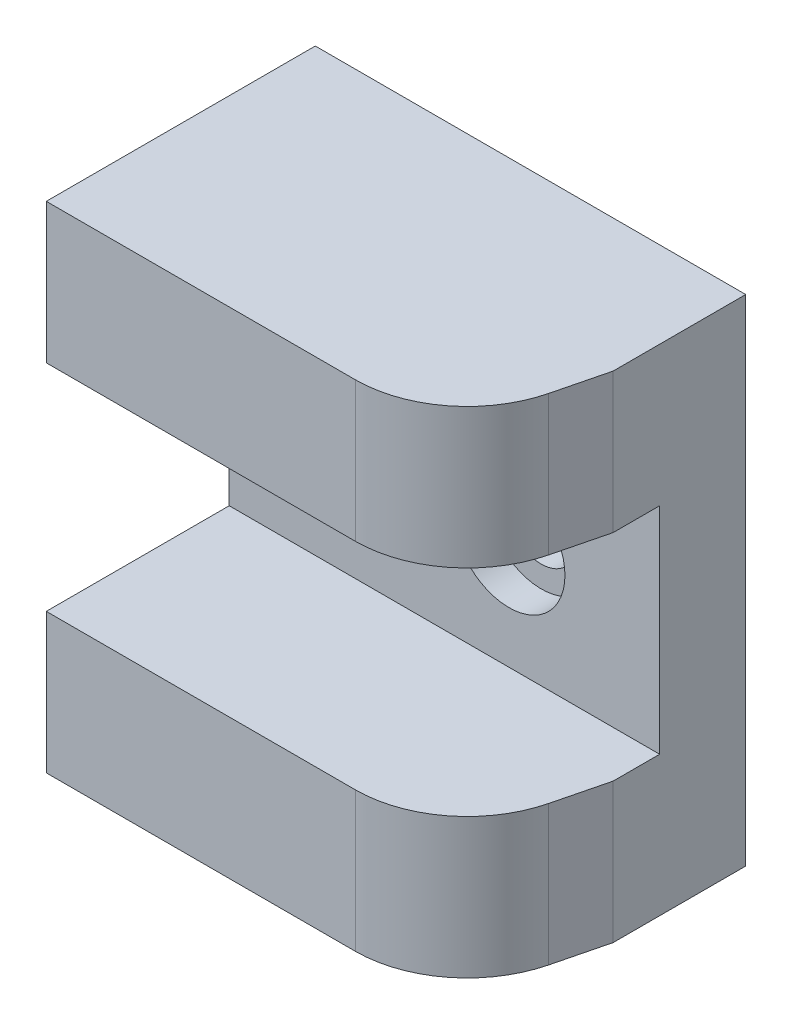
ISO-10303-21;
HEADER;
FILE_DESCRIPTION(('STEP AP214'),'2;1');
FILE_NAME('part.step','',(''),(''),'','','');
FILE_SCHEMA(('AUTOMOTIVE_DESIGN { 1 0 10303 214 1 1 1 1 }'));
ENDSEC;
DATA;
#1=APPLICATION_CONTEXT('core data for automotive mechanical design processes');
#2=APPLICATION_PROTOCOL_DEFINITION('international standard','automotive_design',2000,#1);
#3=PRODUCT_CONTEXT('',#1,'mechanical');
#4=PRODUCT('Part','Part','',(#3));
#5=PRODUCT_RELATED_PRODUCT_CATEGORY('part','',(#4));
#6=PRODUCT_DEFINITION_FORMATION('','',#4);
#7=PRODUCT_DEFINITION_CONTEXT('part definition',#1,'design');
#8=PRODUCT_DEFINITION('design','',#6,#7);
#9=PRODUCT_DEFINITION_SHAPE('','',#8);
#10=(LENGTH_UNIT() NAMED_UNIT(*) SI_UNIT(.MILLI.,.METRE.));
#11=(NAMED_UNIT(*) PLANE_ANGLE_UNIT() SI_UNIT($,.RADIAN.));
#12=(NAMED_UNIT(*) SI_UNIT($,.STERADIAN.) SOLID_ANGLE_UNIT());
#13=UNCERTAINTY_MEASURE_WITH_UNIT(LENGTH_MEASURE(1.E-05),#10,'distance_accuracy_value','');
#14=(GEOMETRIC_REPRESENTATION_CONTEXT(3) GLOBAL_UNCERTAINTY_ASSIGNED_CONTEXT((#13)) GLOBAL_UNIT_ASSIGNED_CONTEXT((#10,
#11,#12)) REPRESENTATION_CONTEXT('',''));
#15=CARTESIAN_POINT('',(0.,0.,0.));
#16=DIRECTION('',(0.,0.,1.));
#17=DIRECTION('',(1.,0.,0.));
#18=AXIS2_PLACEMENT_3D('',#15,#16,#17);
#19=CARTESIAN_POINT('',(0.,0.,12.5));
#20=DIRECTION('',(0.,0.,1.));
#21=DIRECTION('',(1.,0.,0.));
#22=AXIS2_PLACEMENT_3D('',#19,#20,#21);
#23=PLANE('',#22);
#24=DIRECTION('',(1.,0.,0.));
#25=VECTOR('',#24,1.);
#26=CARTESIAN_POINT('',(110.,88.4999999999999,12.5));
#27=LINE('',#26,#25);
#28=CARTESIAN_POINT('',(110.,88.4999999999999,12.5));
#29=VERTEX_POINT('',#28);
#30=CARTESIAN_POINT('',(124.357002553089,88.4999999999999,12.5));
#31=VERTEX_POINT('',#30);
#32=EDGE_CURVE('E142',#29,#31,#27,.T.);
#33=ORIENTED_EDGE('',*,*,#32,.F.);
#34=DIRECTION('',(0.,-1.,0.));
#35=VECTOR('',#34,1.);
#36=CARTESIAN_POINT('',(110.,81.9999999999999,12.5));
#37=LINE('',#36,#35);
#38=CARTESIAN_POINT('',(110.,81.9999999999999,12.5));
#39=VERTEX_POINT('',#38);
#40=EDGE_CURVE('E175',#29,#39,#37,.T.);
#41=ORIENTED_EDGE('',*,*,#40,.T.);
#42=DIRECTION('',(1.,0.,0.));
#43=VECTOR('',#42,1.);
#44=CARTESIAN_POINT('',(130.,81.9999999999999,12.5));
#45=LINE('',#44,#43);
#46=CARTESIAN_POINT('',(124.357002553089,81.9999999999999,12.5000000000004));
#47=VERTEX_POINT('',#46);
#48=EDGE_CURVE('E180',#39,#47,#45,.T.);
#49=ORIENTED_EDGE('',*,*,#48,.T.);
#50=DIRECTION('',(0.,1.,0.));
#51=VECTOR('',#50,1.);
#52=CARTESIAN_POINT('',(124.357002553089,78.4999999999999,12.5000000000002));
#53=LINE('',#52,#51);
#54=EDGE_CURVE('E201',#31,#47,#53,.F.);
#55=ORIENTED_EDGE('',*,*,#54,.F.);
#56=EDGE_LOOP('',(#33,#41,#49,#55));
#57=FACE_BOUND('',#56,.T.);
#58=ADVANCED_FACE('F35',(#57),#23,.T.);
#59=CARTESIAN_POINT('',(129.402540329724,78.4999999999999,8.55799385711866));
#60=DIRECTION('',(-0.970295726275997,0.,-0.241921895599666));
#61=DIRECTION('',(-0.241921895599666,0.,0.970295726275997));
#62=AXIS2_PLACEMENT_3D('',#59,#60,#61);
#63=PLANE('',#62);
#64=DIRECTION('',(0.,1.,0.));
#65=VECTOR('',#64,1.);
#66=CARTESIAN_POINT('',(130.000000000001,78.4999999999999,6.16171400301806));
#67=LINE('',#66,#65);
#68=CARTESIAN_POINT('',(130.000000000001,81.9999999999999,6.16171400301806));
#69=VERTEX_POINT('',#68);
#70=CARTESIAN_POINT('',(130.,88.4999999999999,6.16171400302029));
#71=VERTEX_POINT('',#70);
#72=EDGE_CURVE('E167',#69,#71,#67,.T.);
#73=ORIENTED_EDGE('',*,*,#72,.T.);
#74=DIRECTION('',(-0.241921895599666,0.,0.970295726275997));
#75=VECTOR('',#74,1.);
#76=CARTESIAN_POINT('',(129.402540329724,88.4999999999999,8.55799385711865));
#77=LINE('',#76,#75);
#78=CARTESIAN_POINT('',(129.402540329724,88.4999999999999,8.55799385711866));
#79=VERTEX_POINT('',#78);
#80=EDGE_CURVE('E154',#71,#79,#77,.T.);
#81=ORIENTED_EDGE('',*,*,#80,.T.);
#82=DIRECTION('',(0.,1.,0.));
#83=VECTOR('',#82,1.);
#84=CARTESIAN_POINT('',(129.402540329724,78.4999999999999,8.55799385711866));
#85=LINE('',#84,#83);
#86=CARTESIAN_POINT('',(129.402540329724,81.9999999999999,8.55799385711866));
#87=VERTEX_POINT('',#86);
#88=EDGE_CURVE('E162',#87,#79,#85,.T.);
#89=ORIENTED_EDGE('',*,*,#88,.F.);
#90=DIRECTION('',(-0.241921895599666,0.,0.970295726275997));
#91=VECTOR('',#90,1.);
#92=CARTESIAN_POINT('',(128.512177483807,81.9999999999999,12.1290441834525));
#93=LINE('',#92,#91);
#94=EDGE_CURVE('E204',#69,#87,#93,.T.);
#95=ORIENTED_EDGE('',*,*,#94,.F.);
#96=EDGE_LOOP('',(#73,#81,#89,#95));
#97=FACE_BOUND('',#96,.T.);
#98=ADVANCED_FACE('F248',(#97),#63,.F.);
#99=CARTESIAN_POINT('',(124.357002553089,78.4999999999999,7.3000000000004));
#100=DIRECTION('',(0.,1.,0.));
#101=DIRECTION('',(-1.,0.,0.));
#102=AXIS2_PLACEMENT_3D('',#99,#100,#101);
#103=CYLINDRICAL_SURFACE('',#102,5.20000000000001);
#104=ORIENTED_EDGE('',*,*,#88,.T.);
#105=CARTESIAN_POINT('',(124.357002553089,88.4999999999999,7.3000000000004));
#106=DIRECTION('',(0.,-1.,0.));
#107=DIRECTION('',(0.,0.,-1.));
#108=AXIS2_PLACEMENT_3D('',#105,#106,#107);
#109=CIRCLE('',#108,5.20000000000001);
#110=EDGE_CURVE('E11',#79,#31,#109,.T.);
#111=ORIENTED_EDGE('',*,*,#110,.T.);
#112=ORIENTED_EDGE('',*,*,#54,.T.);
#113=CARTESIAN_POINT('',(124.357002553089,81.9999999999999,7.3000000000004));
#114=DIRECTION('',(0.,1.,0.));
#115=DIRECTION('',(0.,0.,1.));
#116=AXIS2_PLACEMENT_3D('',#113,#114,#115);
#117=CIRCLE('',#116,5.20000000000001);
#118=EDGE_CURVE('E165',#87,#47,#117,.F.);
#119=ORIENTED_EDGE('',*,*,#118,.F.);
#120=EDGE_LOOP('',(#104,#111,#112,#119));
#121=FACE_BOUND('',#120,.T.);
#122=ADVANCED_FACE('F246',(#121),#103,.T.);
#123=CARTESIAN_POINT('',(130.,81.9999999999999,12.5));
#124=DIRECTION('',(-1.,0.,0.));
#125=DIRECTION('',(0.,0.,1.));
#126=AXIS2_PLACEMENT_3D('',#123,#124,#125);
#127=PLANE('',#126);
#128=DIRECTION('',(0.,1.,0.));
#129=VECTOR('',#128,1.);
#130=CARTESIAN_POINT('',(130.,98.4999999999999,4.));
#131=LINE('',#130,#129);
#132=CARTESIAN_POINT('',(130.,88.4999999999999,4.));
#133=VERTEX_POINT('',#132);
#134=CARTESIAN_POINT('',(130.,98.4999999999999,4.));
#135=VERTEX_POINT('',#134);
#136=EDGE_CURVE('E133',#133,#135,#131,.T.);
#137=ORIENTED_EDGE('',*,*,#136,.F.);
#138=DIRECTION('',(0.,0.,1.));
#139=VECTOR('',#138,1.);
#140=CARTESIAN_POINT('',(130.,88.4999999999999,4.));
#141=LINE('',#140,#139);
#142=EDGE_CURVE('E155',#133,#71,#141,.T.);
#143=ORIENTED_EDGE('',*,*,#142,.T.);
#144=ORIENTED_EDGE('',*,*,#72,.F.);
#145=DIRECTION('',(0.,0.,-1.));
#146=VECTOR('',#145,1.);
#147=CARTESIAN_POINT('',(130.,81.9999999999999,12.5));
#148=LINE('',#147,#146);
#149=CARTESIAN_POINT('',(130.,81.9999999999999,0.));
#150=VERTEX_POINT('',#149);
#151=EDGE_CURVE('E183',#69,#150,#148,.T.);
#152=ORIENTED_EDGE('',*,*,#151,.T.);
#153=DIRECTION('',(0.,1.,0.));
#154=VECTOR('',#153,1.);
#155=CARTESIAN_POINT('',(130.,81.9999999999999,0.));
#156=LINE('',#155,#154);
#157=CARTESIAN_POINT('',(130.,105.,0.));
#158=VERTEX_POINT('',#157);
#159=EDGE_CURVE('E172',#150,#158,#156,.T.);
#160=ORIENTED_EDGE('',*,*,#159,.T.);
#161=DIRECTION('',(0.,0.,-1.));
#162=VECTOR('',#161,1.);
#163=CARTESIAN_POINT('',(130.,105.,12.5));
#164=LINE('',#163,#162);
#165=CARTESIAN_POINT('',(130.000000000001,105.,6.16171400301806));
#166=VERTEX_POINT('',#165);
#167=EDGE_CURVE('E199',#166,#158,#164,.T.);
#168=ORIENTED_EDGE('',*,*,#167,.F.);
#169=CARTESIAN_POINT('',(130.,98.4999999999999,6.16171400302017));
#170=VERTEX_POINT('',#169);
#171=EDGE_CURVE('E146',#170,#166,#67,.T.);
#172=ORIENTED_EDGE('',*,*,#171,.F.);
#173=DIRECTION('',(0.,0.,1.));
#174=VECTOR('',#173,1.);
#175=CARTESIAN_POINT('',(130.,98.4999999999999,4.));
#176=LINE('',#175,#174);
#177=EDGE_CURVE('E127',#135,#170,#176,.T.);
#178=ORIENTED_EDGE('',*,*,#177,.F.);
#179=EDGE_LOOP('',(#137,#143,#144,#152,#160,#168,#172,#178));
#180=FACE_BOUND('',#179,.T.);
#181=ADVANCED_FACE('F37',(#180),#127,.F.);
#182=CARTESIAN_POINT('',(130.,105.,12.5));
#183=DIRECTION('',(0.,-1.,0.));
#184=DIRECTION('',(1.,0.,0.));
#185=AXIS2_PLACEMENT_3D('',#182,#183,#184);
#186=PLANE('',#185);
#187=DIRECTION('',(-1.,0.,0.));
#188=VECTOR('',#187,1.);
#189=CARTESIAN_POINT('',(130.,105.,12.5));
#190=LINE('',#189,#188);
#191=CARTESIAN_POINT('',(124.357002553089,105.,12.5));
#192=VERTEX_POINT('',#191);
#193=CARTESIAN_POINT('',(110.,105.,12.5));
#194=VERTEX_POINT('',#193);
#195=EDGE_CURVE('E173',#192,#194,#190,.T.);
#196=ORIENTED_EDGE('',*,*,#195,.F.);
#197=CARTESIAN_POINT('',(124.357002553089,105.,7.3000000000004));
#198=DIRECTION('',(0.,-1.,0.));
#199=DIRECTION('',(-1.,0.,0.));
#200=AXIS2_PLACEMENT_3D('',#197,#198,#199);
#201=CIRCLE('',#200,5.20000000000001);
#202=CARTESIAN_POINT('',(129.402540329724,105.,8.55799385711866));
#203=VERTEX_POINT('',#202);
#204=EDGE_CURVE('E58',#203,#192,#201,.T.);
#205=ORIENTED_EDGE('',*,*,#204,.F.);
#206=DIRECTION('',(-0.241921895599666,0.,0.970295726275997));
#207=VECTOR('',#206,1.);
#208=CARTESIAN_POINT('',(129.402540329724,105.,8.55799385711866));
#209=LINE('',#208,#207);
#210=EDGE_CURVE('E159',#166,#203,#209,.T.);
#211=ORIENTED_EDGE('',*,*,#210,.F.);
#212=ORIENTED_EDGE('',*,*,#167,.T.);
#213=DIRECTION('',(-1.,0.,0.));
#214=VECTOR('',#213,1.);
#215=CARTESIAN_POINT('',(130.,105.,0.));
#216=LINE('',#215,#214);
#217=CARTESIAN_POINT('',(110.,105.,0.));
#218=VERTEX_POINT('',#217);
#219=EDGE_CURVE('E186',#158,#218,#216,.T.);
#220=ORIENTED_EDGE('',*,*,#219,.T.);
#221=DIRECTION('',(0.,0.,-1.));
#222=VECTOR('',#221,1.);
#223=CARTESIAN_POINT('',(110.,105.,12.5));
#224=LINE('',#223,#222);
#225=EDGE_CURVE('E196',#194,#218,#224,.T.);
#226=ORIENTED_EDGE('',*,*,#225,.F.);
#227=EDGE_LOOP('',(#196,#205,#211,#212,#220,#226));
#228=FACE_BOUND('',#227,.T.);
#229=ADVANCED_FACE('F214',(#228),#186,.F.);
#230=CARTESIAN_POINT('',(110.,81.9999999999999,12.5));
#231=DIRECTION('',(1.,0.,0.));
#232=DIRECTION('',(0.,0.,-1.));
#233=AXIS2_PLACEMENT_3D('',#230,#231,#232);
#234=PLANE('',#233);
#235=ORIENTED_EDGE('',*,*,#40,.F.);
#236=DIRECTION('',(0.,0.,1.));
#237=VECTOR('',#236,1.);
#238=CARTESIAN_POINT('',(110.,88.4999999999999,4.));
#239=LINE('',#238,#237);
#240=CARTESIAN_POINT('',(110.,88.4999999999999,4.));
#241=VERTEX_POINT('',#240);
#242=EDGE_CURVE('E148',#241,#29,#239,.T.);
#243=ORIENTED_EDGE('',*,*,#242,.F.);
#244=DIRECTION('',(0.,-1.,0.));
#245=VECTOR('',#244,1.);
#246=CARTESIAN_POINT('',(110.,98.4999999999999,4.));
#247=LINE('',#246,#245);
#248=CARTESIAN_POINT('',(110.,98.4999999999999,4.));
#249=VERTEX_POINT('',#248);
#250=EDGE_CURVE('E132',#249,#241,#247,.T.);
#251=ORIENTED_EDGE('',*,*,#250,.F.);
#252=DIRECTION('',(0.,0.,1.));
#253=VECTOR('',#252,1.);
#254=CARTESIAN_POINT('',(110.,98.4999999999999,4.));
#255=LINE('',#254,#253);
#256=CARTESIAN_POINT('',(110.,98.4999999999999,12.5));
#257=VERTEX_POINT('',#256);
#258=EDGE_CURVE('E129',#249,#257,#255,.T.);
#259=ORIENTED_EDGE('',*,*,#258,.T.);
#260=EDGE_CURVE('E177',#194,#257,#37,.T.);
#261=ORIENTED_EDGE('',*,*,#260,.F.);
#262=ORIENTED_EDGE('',*,*,#225,.T.);
#263=DIRECTION('',(0.,-1.,0.));
#264=VECTOR('',#263,1.);
#265=CARTESIAN_POINT('',(110.,81.9999999999999,0.));
#266=LINE('',#265,#264);
#267=CARTESIAN_POINT('',(110.,81.9999999999999,0.));
#268=VERTEX_POINT('',#267);
#269=EDGE_CURVE('E188',#218,#268,#266,.T.);
#270=ORIENTED_EDGE('',*,*,#269,.T.);
#271=DIRECTION('',(0.,0.,-1.));
#272=VECTOR('',#271,1.);
#273=CARTESIAN_POINT('',(110.,81.9999999999999,12.5));
#274=LINE('',#273,#272);
#275=EDGE_CURVE('E193',#39,#268,#274,.T.);
#276=ORIENTED_EDGE('',*,*,#275,.F.);
#277=EDGE_LOOP('',(#235,#243,#251,#259,#261,#262,#270,#276));
#278=FACE_BOUND('',#277,.T.);
#279=ADVANCED_FACE('F237',(#278),#234,.F.);
#280=CARTESIAN_POINT('',(130.,81.9999999999999,12.5));
#281=DIRECTION('',(0.,1.,0.));
#282=DIRECTION('',(0.,0.,1.));
#283=AXIS2_PLACEMENT_3D('',#280,#281,#282);
#284=PLANE('',#283);
#285=ORIENTED_EDGE('',*,*,#94,.T.);
#286=ORIENTED_EDGE('',*,*,#118,.T.);
#287=ORIENTED_EDGE('',*,*,#48,.F.);
#288=ORIENTED_EDGE('',*,*,#275,.T.);
#289=DIRECTION('',(1.,0.,0.));
#290=VECTOR('',#289,1.);
#291=CARTESIAN_POINT('',(130.,81.9999999999999,0.));
#292=LINE('',#291,#290);
#293=EDGE_CURVE('E176',#268,#150,#292,.T.);
#294=ORIENTED_EDGE('',*,*,#293,.T.);
#295=ORIENTED_EDGE('',*,*,#151,.F.);
#296=EDGE_LOOP('',(#285,#286,#287,#288,#294,#295));
#297=FACE_BOUND('',#296,.T.);
#298=ADVANCED_FACE('F242',(#297),#284,.F.);
#299=DIRECTION('',(-1.,0.,0.));
#300=VECTOR('',#299,1.);
#301=CARTESIAN_POINT('',(110.,98.4999999999999,12.5));
#302=LINE('',#301,#300);
#303=CARTESIAN_POINT('',(124.357002553089,98.4999999999999,12.5));
#304=VERTEX_POINT('',#303);
#305=EDGE_CURVE('E219',#304,#257,#302,.T.);
#306=ORIENTED_EDGE('',*,*,#305,.F.);
#307=EDGE_CURVE('E202',#192,#304,#53,.F.);
#308=ORIENTED_EDGE('',*,*,#307,.F.);
#309=ORIENTED_EDGE('',*,*,#195,.T.);
#310=ORIENTED_EDGE('',*,*,#260,.T.);
#311=EDGE_LOOP('',(#306,#308,#309,#310));
#312=FACE_BOUND('',#311,.T.);
#313=ADVANCED_FACE('F218',(#312),#23,.T.);
#314=CARTESIAN_POINT('',(0.,0.,0.));
#315=DIRECTION('',(0.,0.,1.));
#316=DIRECTION('',(1.,0.,0.));
#317=AXIS2_PLACEMENT_3D('',#314,#315,#316);
#318=PLANE('',#317);
#319=CARTESIAN_POINT('',(115.,93.4999999999999,0.));
#320=DIRECTION('',(0.,0.,1.));
#321=DIRECTION('',(1.,0.,0.));
#322=AXIS2_PLACEMENT_3D('',#319,#320,#321);
#323=CIRCLE('',#322,1.6);
#324=CARTESIAN_POINT('',(116.6,93.4999999999999,0.));
#325=VERTEX_POINT('',#324);
#326=EDGE_CURVE('E263',#325,#325,#323,.T.);
#327=ORIENTED_EDGE('',*,*,#326,.T.);
#328=EDGE_LOOP('',(#327));
#329=FACE_BOUND('',#328,.T.);
#330=CARTESIAN_POINT('',(123.,93.4999999999999,0.));
#331=DIRECTION('',(0.,0.,1.));
#332=DIRECTION('',(1.,0.,0.));
#333=AXIS2_PLACEMENT_3D('',#330,#331,#332);
#334=CIRCLE('',#333,1.6);
#335=CARTESIAN_POINT('',(124.6,93.4999999999999,0.));
#336=VERTEX_POINT('',#335);
#337=EDGE_CURVE('E220',#336,#336,#334,.T.);
#338=ORIENTED_EDGE('',*,*,#337,.T.);
#339=EDGE_LOOP('',(#338));
#340=FACE_BOUND('',#339,.T.);
#341=ORIENTED_EDGE('',*,*,#159,.F.);
#342=ORIENTED_EDGE('',*,*,#293,.F.);
#343=ORIENTED_EDGE('',*,*,#269,.F.);
#344=ORIENTED_EDGE('',*,*,#219,.F.);
#345=EDGE_LOOP('',(#341,#342,#343,#344));
#346=FACE_BOUND('',#345,.T.);
#347=ADVANCED_FACE('F253',(#329,#340,#346),#318,.F.);
#348=CARTESIAN_POINT('',(129.402540329724,98.4999999999999,8.55799385711866));
#349=VERTEX_POINT('',#348);
#350=EDGE_CURVE('E166',#349,#203,#85,.T.);
#351=ORIENTED_EDGE('',*,*,#350,.F.);
#352=DIRECTION('',(0.241921895599666,0.,-0.970295726275997));
#353=VECTOR('',#352,1.);
#354=CARTESIAN_POINT('',(129.402540329724,98.4999999999999,8.55799385711865));
#355=LINE('',#354,#353);
#356=EDGE_CURVE('E50',#349,#170,#355,.T.);
#357=ORIENTED_EDGE('',*,*,#356,.T.);
#358=ORIENTED_EDGE('',*,*,#171,.T.);
#359=ORIENTED_EDGE('',*,*,#210,.T.);
#360=EDGE_LOOP('',(#351,#357,#358,#359));
#361=FACE_BOUND('',#360,.T.);
#362=ADVANCED_FACE('F210',(#361),#63,.F.);
#363=ORIENTED_EDGE('',*,*,#307,.T.);
#364=CARTESIAN_POINT('',(124.357002553089,98.4999999999999,7.3000000000004));
#365=DIRECTION('',(0.,1.,0.));
#366=DIRECTION('',(0.,0.,1.));
#367=AXIS2_PLACEMENT_3D('',#364,#365,#366);
#368=CIRCLE('',#367,5.20000000000001);
#369=EDGE_CURVE('E43',#304,#349,#368,.T.);
#370=ORIENTED_EDGE('',*,*,#369,.T.);
#371=ORIENTED_EDGE('',*,*,#350,.T.);
#372=ORIENTED_EDGE('',*,*,#204,.T.);
#373=EDGE_LOOP('',(#363,#370,#371,#372));
#374=FACE_BOUND('',#373,.T.);
#375=ADVANCED_FACE('F207',(#374),#103,.T.);
#376=CARTESIAN_POINT('',(110.,88.4999999999999,4.));
#377=DIRECTION('',(0.,-1.,0.));
#378=DIRECTION('',(0.,0.,-1.));
#379=AXIS2_PLACEMENT_3D('',#376,#377,#378);
#380=PLANE('',#379);
#381=ORIENTED_EDGE('',*,*,#142,.F.);
#382=DIRECTION('',(1.,0.,0.));
#383=VECTOR('',#382,1.);
#384=CARTESIAN_POINT('',(110.,88.4999999999999,4.));
#385=LINE('',#384,#383);
#386=EDGE_CURVE('E139',#241,#133,#385,.T.);
#387=ORIENTED_EDGE('',*,*,#386,.F.);
#388=ORIENTED_EDGE('',*,*,#242,.T.);
#389=ORIENTED_EDGE('',*,*,#32,.T.);
#390=ORIENTED_EDGE('',*,*,#110,.F.);
#391=ORIENTED_EDGE('',*,*,#80,.F.);
#392=EDGE_LOOP('',(#381,#387,#388,#389,#390,#391));
#393=FACE_BOUND('',#392,.T.);
#394=ADVANCED_FACE('F231',(#393),#380,.F.);
#395=CARTESIAN_POINT('',(110.,98.4999999999999,4.));
#396=DIRECTION('',(0.,1.,0.));
#397=DIRECTION('',(0.,0.,1.));
#398=AXIS2_PLACEMENT_3D('',#395,#396,#397);
#399=PLANE('',#398);
#400=ORIENTED_EDGE('',*,*,#369,.F.);
#401=ORIENTED_EDGE('',*,*,#305,.T.);
#402=ORIENTED_EDGE('',*,*,#258,.F.);
#403=DIRECTION('',(-1.,0.,0.));
#404=VECTOR('',#403,1.);
#405=CARTESIAN_POINT('',(110.,98.4999999999999,4.));
#406=LINE('',#405,#404);
#407=EDGE_CURVE('E123',#135,#249,#406,.T.);
#408=ORIENTED_EDGE('',*,*,#407,.F.);
#409=ORIENTED_EDGE('',*,*,#177,.T.);
#410=ORIENTED_EDGE('',*,*,#356,.F.);
#411=EDGE_LOOP('',(#400,#401,#402,#408,#409,#410));
#412=FACE_BOUND('',#411,.T.);
#413=ADVANCED_FACE('F125',(#412),#399,.F.);
#414=CARTESIAN_POINT('',(0.,0.,4.));
#415=DIRECTION('',(0.,0.,1.));
#416=DIRECTION('',(1.,0.,0.));
#417=AXIS2_PLACEMENT_3D('',#414,#415,#416);
#418=PLANE('',#417);
#419=CARTESIAN_POINT('',(115.,93.4999999999999,4.));
#420=DIRECTION('',(0.,0.,1.));
#421=DIRECTION('',(1.,0.,0.));
#422=AXIS2_PLACEMENT_3D('',#419,#420,#421);
#423=CIRCLE('',#422,2.6);
#424=CARTESIAN_POINT('',(117.6,93.4999999999999,4.));
#425=VERTEX_POINT('',#424);
#426=EDGE_CURVE('E272',#425,#425,#423,.T.);
#427=ORIENTED_EDGE('',*,*,#426,.F.);
#428=EDGE_LOOP('',(#427));
#429=FACE_BOUND('',#428,.T.);
#430=CARTESIAN_POINT('',(123.,93.4999999999999,4.));
#431=DIRECTION('',(0.,0.,1.));
#432=DIRECTION('',(1.,0.,0.));
#433=AXIS2_PLACEMENT_3D('',#430,#431,#432);
#434=CIRCLE('',#433,2.59999999999999);
#435=CARTESIAN_POINT('',(125.6,93.4999999999999,4.));
#436=VERTEX_POINT('',#435);
#437=EDGE_CURVE('E260',#436,#436,#434,.T.);
#438=ORIENTED_EDGE('',*,*,#437,.F.);
#439=EDGE_LOOP('',(#438));
#440=FACE_BOUND('',#439,.T.);
#441=ORIENTED_EDGE('',*,*,#136,.T.);
#442=ORIENTED_EDGE('',*,*,#407,.T.);
#443=ORIENTED_EDGE('',*,*,#250,.T.);
#444=ORIENTED_EDGE('',*,*,#386,.T.);
#445=EDGE_LOOP('',(#441,#442,#443,#444));
#446=FACE_BOUND('',#445,.T.);
#447=ADVANCED_FACE('F137',(#429,#440,#446),#418,.T.);
#448=CARTESIAN_POINT('',(123.,93.4999999999999,4.));
#449=DIRECTION('',(0.,0.,1.));
#450=DIRECTION('',(1.,0.,0.));
#451=AXIS2_PLACEMENT_3D('',#448,#449,#450);
#452=CYLINDRICAL_SURFACE('',#451,1.6);
#453=ORIENTED_EDGE('',*,*,#337,.F.);
#454=EDGE_LOOP('',(#453));
#455=FACE_BOUND('',#454,.T.);
#456=CARTESIAN_POINT('',(123.,93.4999999999999,2.5));
#457=DIRECTION('',(0.,0.,1.));
#458=DIRECTION('',(1.,0.,0.));
#459=AXIS2_PLACEMENT_3D('',#456,#457,#458);
#460=CIRCLE('',#459,1.6);
#461=CARTESIAN_POINT('',(124.6,93.4999999999999,2.5));
#462=VERTEX_POINT('',#461);
#463=EDGE_CURVE('E224',#462,#462,#460,.T.);
#464=ORIENTED_EDGE('',*,*,#463,.T.);
#465=EDGE_LOOP('',(#464));
#466=FACE_BOUND('',#465,.T.);
#467=ADVANCED_FACE('F280',(#455,#466),#452,.F.);
#468=CARTESIAN_POINT('',(124.6,93.4999999999999,2.5));
#469=DIRECTION('',(0.,0.,-1.));
#470=DIRECTION('',(-1.,0.,0.));
#471=AXIS2_PLACEMENT_3D('',#468,#469,#470);
#472=PLANE('',#471);
#473=ORIENTED_EDGE('',*,*,#463,.F.);
#474=EDGE_LOOP('',(#473));
#475=FACE_BOUND('',#474,.T.);
#476=CARTESIAN_POINT('',(123.,93.4999999999999,2.5));
#477=DIRECTION('',(0.,0.,1.));
#478=DIRECTION('',(1.,0.,0.));
#479=AXIS2_PLACEMENT_3D('',#476,#477,#478);
#480=CIRCLE('',#479,2.59999999999999);
#481=CARTESIAN_POINT('',(125.6,93.4999999999999,2.5));
#482=VERTEX_POINT('',#481);
#483=EDGE_CURVE('E257',#482,#482,#480,.T.);
#484=ORIENTED_EDGE('',*,*,#483,.T.);
#485=EDGE_LOOP('',(#484));
#486=FACE_BOUND('',#485,.T.);
#487=ADVANCED_FACE('F287',(#475,#486),#472,.F.);
#488=CARTESIAN_POINT('',(123.,93.4999999999999,4.));
#489=DIRECTION('',(0.,0.,1.));
#490=DIRECTION('',(1.,0.,0.));
#491=AXIS2_PLACEMENT_3D('',#488,#489,#490);
#492=CYLINDRICAL_SURFACE('',#491,2.59999999999999);
#493=ORIENTED_EDGE('',*,*,#483,.F.);
#494=EDGE_LOOP('',(#493));
#495=FACE_BOUND('',#494,.T.);
#496=ORIENTED_EDGE('',*,*,#437,.T.);
#497=EDGE_LOOP('',(#496));
#498=FACE_BOUND('',#497,.T.);
#499=ADVANCED_FACE('F284',(#495,#498),#492,.F.);
#500=CARTESIAN_POINT('',(115.,93.4999999999999,4.));
#501=DIRECTION('',(0.,0.,1.));
#502=DIRECTION('',(1.,0.,0.));
#503=AXIS2_PLACEMENT_3D('',#500,#501,#502);
#504=CYLINDRICAL_SURFACE('',#503,1.6);
#505=ORIENTED_EDGE('',*,*,#326,.F.);
#506=EDGE_LOOP('',(#505));
#507=FACE_BOUND('',#506,.T.);
#508=CARTESIAN_POINT('',(115.,93.4999999999999,2.5));
#509=DIRECTION('',(0.,0.,1.));
#510=DIRECTION('',(1.,0.,0.));
#511=AXIS2_PLACEMENT_3D('',#508,#509,#510);
#512=CIRCLE('',#511,1.6);
#513=CARTESIAN_POINT('',(116.6,93.4999999999999,2.5));
#514=VERTEX_POINT('',#513);
#515=EDGE_CURVE('E266',#514,#514,#512,.T.);
#516=ORIENTED_EDGE('',*,*,#515,.T.);
#517=EDGE_LOOP('',(#516));
#518=FACE_BOUND('',#517,.T.);
#519=ADVANCED_FACE('F286',(#507,#518),#504,.F.);
#520=CARTESIAN_POINT('',(116.6,93.4999999999999,2.5));
#521=DIRECTION('',(0.,0.,-1.));
#522=DIRECTION('',(-1.,0.,0.));
#523=AXIS2_PLACEMENT_3D('',#520,#521,#522);
#524=PLANE('',#523);
#525=ORIENTED_EDGE('',*,*,#515,.F.);
#526=EDGE_LOOP('',(#525));
#527=FACE_BOUND('',#526,.T.);
#528=CARTESIAN_POINT('',(115.,93.4999999999999,2.5));
#529=DIRECTION('',(0.,0.,1.));
#530=DIRECTION('',(1.,0.,0.));
#531=AXIS2_PLACEMENT_3D('',#528,#529,#530);
#532=CIRCLE('',#531,2.6);
#533=CARTESIAN_POINT('',(117.6,93.4999999999999,2.5));
#534=VERTEX_POINT('',#533);
#535=EDGE_CURVE('E269',#534,#534,#532,.T.);
#536=ORIENTED_EDGE('',*,*,#535,.T.);
#537=EDGE_LOOP('',(#536));
#538=FACE_BOUND('',#537,.T.);
#539=ADVANCED_FACE('F294',(#527,#538),#524,.F.);
#540=CARTESIAN_POINT('',(115.,93.4999999999999,4.));
#541=DIRECTION('',(0.,0.,1.));
#542=DIRECTION('',(1.,0.,0.));
#543=AXIS2_PLACEMENT_3D('',#540,#541,#542);
#544=CYLINDRICAL_SURFACE('',#543,2.6);
#545=ORIENTED_EDGE('',*,*,#535,.F.);
#546=EDGE_LOOP('',(#545));
#547=FACE_BOUND('',#546,.T.);
#548=ORIENTED_EDGE('',*,*,#426,.T.);
#549=EDGE_LOOP('',(#548));
#550=FACE_BOUND('',#549,.T.);
#551=ADVANCED_FACE('F276',(#547,#550),#544,.F.);
#552=CLOSED_SHELL('',(#58,#98,#122,#181,#229,#279,#298,#313,#347,#362,#375,#394,#413,#447,#467,
#487,#499,#519,#539,#551));
#553=MANIFOLD_SOLID_BREP('B2',#552);
#554=ADVANCED_BREP_SHAPE_REPRESENTATION('',(#18,#553),#14);
#555=SHAPE_DEFINITION_REPRESENTATION(#9,#554);
ENDSEC;
END-ISO-10303-21;
